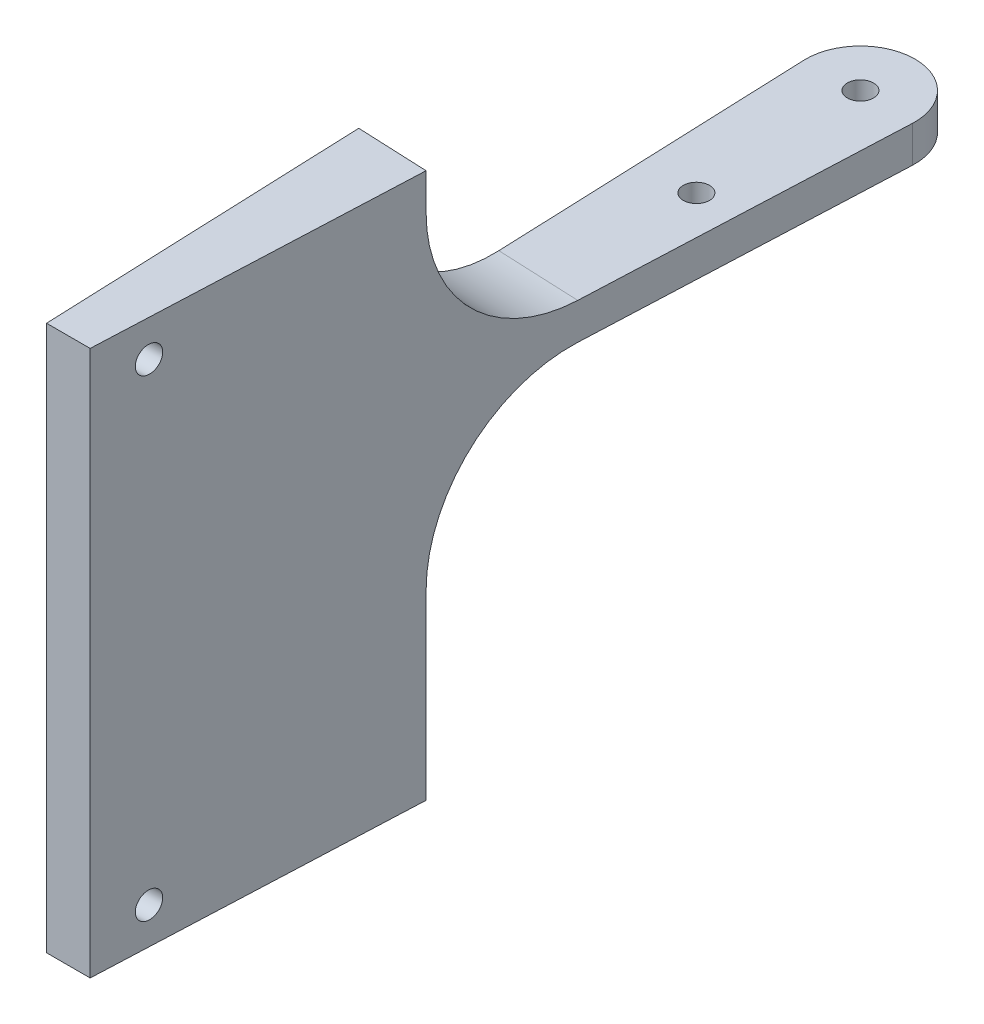
ISO-10303-21;
HEADER;
FILE_DESCRIPTION(('STEP AP214'),'2;1');
FILE_NAME('part.step','',(''),(''),'','','');
FILE_SCHEMA(('AUTOMOTIVE_DESIGN { 1 0 10303 214 1 1 1 1 }'));
ENDSEC;
DATA;
#1=APPLICATION_CONTEXT('core data for automotive mechanical design processes');
#2=APPLICATION_PROTOCOL_DEFINITION('international standard','automotive_design',2000,#1);
#3=PRODUCT_CONTEXT('',#1,'mechanical');
#4=PRODUCT('Part','Part','',(#3));
#5=PRODUCT_RELATED_PRODUCT_CATEGORY('part','',(#4));
#6=PRODUCT_DEFINITION_FORMATION('','',#4);
#7=PRODUCT_DEFINITION_CONTEXT('part definition',#1,'design');
#8=PRODUCT_DEFINITION('design','',#6,#7);
#9=PRODUCT_DEFINITION_SHAPE('','',#8);
#10=(LENGTH_UNIT() NAMED_UNIT(*) SI_UNIT(.MILLI.,.METRE.));
#11=(NAMED_UNIT(*) PLANE_ANGLE_UNIT() SI_UNIT($,.RADIAN.));
#12=(NAMED_UNIT(*) SI_UNIT($,.STERADIAN.) SOLID_ANGLE_UNIT());
#13=UNCERTAINTY_MEASURE_WITH_UNIT(LENGTH_MEASURE(1.E-05),#10,'distance_accuracy_value','');
#14=(GEOMETRIC_REPRESENTATION_CONTEXT(3) GLOBAL_UNCERTAINTY_ASSIGNED_CONTEXT((#13)) GLOBAL_UNIT_ASSIGNED_CONTEXT((#10,
#11,#12)) REPRESENTATION_CONTEXT('',''));
#15=CARTESIAN_POINT('',(0.,0.,0.));
#16=DIRECTION('',(0.,0.,1.));
#17=DIRECTION('',(1.,0.,0.));
#18=AXIS2_PLACEMENT_3D('',#15,#16,#17);
#19=CARTESIAN_POINT('',(11.0642197604741,5.,0.484217790133408));
#20=DIRECTION('',(0.999043716659606,0.,0.043722445070709));
#21=DIRECTION('',(0.043722445070709,0.,-0.999043716659606));
#22=AXIS2_PLACEMENT_3D('',#19,#20,#21);
#23=PLANE('',#22);
#24=CARTESIAN_POINT('',(6.33934570406994,-40.,108.446060510152));
#25=DIRECTION('',(0.999043716659606,0.,0.043722445070709));
#26=DIRECTION('',(-0.043722445070709,0.,0.999043716659606));
#27=AXIS2_PLACEMENT_3D('',#24,#25,#26);
#28=ELLIPSE('',#27,1.8061980830107,1.8);
#29=CARTESIAN_POINT('',(6.26037430759868,-40.,110.250531356026));
#30=VERTEX_POINT('',#29);
#31=EDGE_CURVE('E363',#30,#30,#28,.T.);
#32=ORIENTED_EDGE('',*,*,#31,.F.);
#33=EDGE_LOOP('',(#32));
#34=FACE_BOUND('',#33,.T.);
#35=CARTESIAN_POINT('',(6.33934570406994,25.,108.446060510152));
#36=DIRECTION('',(0.999043716659606,0.,0.043722445070709));
#37=DIRECTION('',(-0.043722445070709,0.,0.999043716659606));
#38=AXIS2_PLACEMENT_3D('',#35,#36,#37);
#39=ELLIPSE('',#38,1.8061980830107,1.8);
#40=CARTESIAN_POINT('',(6.26037430759868,25.,110.250531356026));
#41=VERTEX_POINT('',#40);
#42=EDGE_CURVE('E367',#41,#41,#39,.T.);
#43=ORIENTED_EDGE('',*,*,#42,.F.);
#44=EDGE_LOOP('',(#43));
#45=FACE_BOUND('',#44,.T.);
#46=DIRECTION('',(-0.043722445070709,0.,0.999043716659606));
#47=VECTOR('',#46,1.);
#48=CARTESIAN_POINT('',(11.0642197604741,5.,0.484217790133408));
#49=LINE('',#48,#47);
#50=CARTESIAN_POINT('',(10.742827874947,5.,7.82791833803032));
#51=VERTEX_POINT('',#50);
#52=CARTESIAN_POINT('',(8.81200819002346,5.,51.9465231211344));
#53=VERTEX_POINT('',#52);
#54=EDGE_CURVE('E185',#51,#53,#49,.T.);
#55=ORIENTED_EDGE('',*,*,#54,.T.);
#56=CARTESIAN_POINT('',(8.81200819002346,25.,51.9465231211344));
#57=DIRECTION('',(0.999043716659606,0.,0.043722445070709));
#58=DIRECTION('',(0.043722445070709,0.,-0.999043716659606));
#59=AXIS2_PLACEMENT_3D('',#56,#57,#58);
#60=CIRCLE('',#59,20.);
#61=CARTESIAN_POINT('',(7.93755928860928,25.,71.9273974543265));
#62=VERTEX_POINT('',#61);
#63=EDGE_CURVE('E12',#53,#62,#60,.F.);
#64=ORIENTED_EDGE('',*,*,#63,.T.);
#65=DIRECTION('',(0.,1.,0.));
#66=VECTOR('',#65,1.);
#67=CARTESIAN_POINT('',(7.93755928860928,-45.,71.9273974543265));
#68=LINE('',#67,#66);
#69=CARTESIAN_POINT('',(7.93755928860928,30.,71.9273974543265));
#70=VERTEX_POINT('',#69);
#71=EDGE_CURVE('E176',#62,#70,#68,.T.);
#72=ORIENTED_EDGE('',*,*,#71,.T.);
#73=DIRECTION('',(0.043722445070709,0.,-0.999043716659606));
#74=VECTOR('',#73,1.);
#75=CARTESIAN_POINT('',(7.93755928860928,30.,71.9273974543265));
#76=LINE('',#75,#74);
#77=CARTESIAN_POINT('',(6.00000000000001,30.,116.2));
#78=VERTEX_POINT('',#77);
#79=EDGE_CURVE('E152',#78,#70,#76,.T.);
#80=ORIENTED_EDGE('',*,*,#79,.F.);
#81=DIRECTION('',(0.,-1.,0.));
#82=VECTOR('',#81,1.);
#83=CARTESIAN_POINT('',(6.00000000000001,5.,116.2));
#84=LINE('',#83,#82);
#85=CARTESIAN_POINT('',(6.00000000000001,-45.,116.2));
#86=VERTEX_POINT('',#85);
#87=EDGE_CURVE('E144',#78,#86,#84,.T.);
#88=ORIENTED_EDGE('',*,*,#87,.T.);
#89=DIRECTION('',(0.043722445070709,0.,-0.999043716659606));
#90=VECTOR('',#89,1.);
#91=CARTESIAN_POINT('',(7.93755928860928,-45.,71.9273974543265));
#92=LINE('',#91,#90);
#93=CARTESIAN_POINT('',(7.93755928860928,-45.,71.9273974543265));
#94=VERTEX_POINT('',#93);
#95=EDGE_CURVE('E170',#86,#94,#92,.T.);
#96=ORIENTED_EDGE('',*,*,#95,.T.);
#97=CARTESIAN_POINT('',(7.93755928860928,-20.,71.9273974543265));
#98=VERTEX_POINT('',#97);
#99=EDGE_CURVE('E182',#94,#98,#68,.T.);
#100=ORIENTED_EDGE('',*,*,#99,.T.);
#101=CARTESIAN_POINT('',(8.81200819002346,-20.,51.9465231211344));
#102=DIRECTION('',(0.999043716659606,0.,0.043722445070709));
#103=DIRECTION('',(0.043722445070709,0.,-0.999043716659606));
#104=AXIS2_PLACEMENT_3D('',#101,#102,#103);
#105=CIRCLE('',#104,20.);
#106=CARTESIAN_POINT('',(8.81200819002346,0.,51.9465231211344));
#107=VERTEX_POINT('',#106);
#108=EDGE_CURVE('E213',#98,#107,#105,.F.);
#109=ORIENTED_EDGE('',*,*,#108,.T.);
#110=DIRECTION('',(-0.043722445070709,0.,0.999043716659606));
#111=VECTOR('',#110,1.);
#112=CARTESIAN_POINT('',(11.0642197604741,0.,0.484217790133408));
#113=LINE('',#112,#111);
#114=CARTESIAN_POINT('',(10.742827874947,0.,7.82791833803032));
#115=VERTEX_POINT('',#114);
#116=EDGE_CURVE('E180',#115,#107,#113,.T.);
#117=ORIENTED_EDGE('',*,*,#116,.F.);
#118=DIRECTION('',(0.,-1.,0.));
#119=VECTOR('',#118,1.);
#120=CARTESIAN_POINT('',(10.742827874947,5.,7.82791833803032));
#121=LINE('',#120,#119);
#122=EDGE_CURVE('E200',#51,#115,#121,.T.);
#123=ORIENTED_EDGE('',*,*,#122,.F.);
#124=EDGE_LOOP('',(#55,#64,#72,#80,#88,#96,#100,#109,#117,#123));
#125=FACE_BOUND('',#124,.T.);
#126=ADVANCED_FACE('F56',(#34,#45,#125),#23,.T.);
#127=CARTESIAN_POINT('',(3.25,5.,7.5));
#128=DIRECTION('',(0.,-1.,0.));
#129=DIRECTION('',(0.,0.,-1.));
#130=AXIS2_PLACEMENT_3D('',#127,#128,#129);
#131=CYLINDRICAL_SURFACE('',#130,7.5);
#132=CARTESIAN_POINT('',(3.25,0.,7.5));
#133=DIRECTION('',(0.,1.,0.));
#134=DIRECTION('',(0.,0.,1.));
#135=AXIS2_PLACEMENT_3D('',#132,#133,#134);
#136=CIRCLE('',#135,7.5);
#137=CARTESIAN_POINT('',(-4.24425850972163,0.,7.79340993416196));
#138=VERTEX_POINT('',#137);
#139=EDGE_CURVE('E194',#115,#138,#136,.T.);
#140=ORIENTED_EDGE('',*,*,#139,.T.);
#141=DIRECTION('',(0.,-1.,0.));
#142=VECTOR('',#141,1.);
#143=CARTESIAN_POINT('',(-4.24425850972163,5.,7.79340993416196));
#144=LINE('',#143,#142);
#145=CARTESIAN_POINT('',(-4.24425850972163,5.,7.79340993416196));
#146=VERTEX_POINT('',#145);
#147=EDGE_CURVE('E143',#146,#138,#144,.T.);
#148=ORIENTED_EDGE('',*,*,#147,.F.);
#149=CARTESIAN_POINT('',(3.25,5.,7.5));
#150=DIRECTION('',(0.,1.,0.));
#151=DIRECTION('',(0.,0.,1.));
#152=AXIS2_PLACEMENT_3D('',#149,#150,#151);
#153=CIRCLE('',#152,7.5);
#154=EDGE_CURVE('E187',#51,#146,#153,.T.);
#155=ORIENTED_EDGE('',*,*,#154,.F.);
#156=ORIENTED_EDGE('',*,*,#122,.T.);
#157=EDGE_LOOP('',(#140,#148,#155,#156));
#158=FACE_BOUND('',#157,.T.);
#159=ADVANCED_FACE('F241',(#158),#131,.T.);
#160=CARTESIAN_POINT('',(-4.5424178827925,5.,0.177841547659096));
#161=DIRECTION('',(0.999234467962884,0.,-0.0391213245549277));
#162=DIRECTION('',(-0.0391213245549277,0.,-0.999234467962884));
#163=AXIS2_PLACEMENT_3D('',#160,#161,#162);
#164=PLANE('',#163);
#165=CARTESIAN_POINT('',(-0.293409934161943,-40.,108.705741490278));
#166=DIRECTION('',(-0.999234467962884,0.,0.0391213245549277));
#167=DIRECTION('',(0.0391213245549277,0.,0.999234467962884));
#168=AXIS2_PLACEMENT_3D('',#165,#166,#167);
#169=CIRCLE('',#168,1.8);
#170=CARTESIAN_POINT('',(-0.222991549963073,-40.,110.504363532612));
#171=VERTEX_POINT('',#170);
#172=EDGE_CURVE('E366',#171,#171,#169,.T.);
#173=ORIENTED_EDGE('',*,*,#172,.F.);
#174=EDGE_LOOP('',(#173));
#175=FACE_BOUND('',#174,.T.);
#176=CARTESIAN_POINT('',(-0.293409934161943,25.,108.705741490278));
#177=DIRECTION('',(-0.999234467962884,0.,0.0391213245549277));
#178=DIRECTION('',(0.0391213245549277,0.,0.999234467962884));
#179=AXIS2_PLACEMENT_3D('',#176,#177,#178);
#180=CIRCLE('',#179,1.8);
#181=CARTESIAN_POINT('',(-0.222991549963073,25.,110.504363532612));
#182=VERTEX_POINT('',#181);
#183=EDGE_CURVE('E368',#182,#182,#180,.T.);
#184=ORIENTED_EDGE('',*,*,#183,.F.);
#185=EDGE_LOOP('',(#184));
#186=FACE_BOUND('',#185,.T.);
#187=DIRECTION('',(0.0391213245549277,0.,0.999234467962884));
#188=VECTOR('',#187,1.);
#189=CARTESIAN_POINT('',(-4.5424178827925,0.,0.177841547659096));
#190=LINE('',#189,#188);
#191=CARTESIAN_POINT('',(-2.53504927683207,0.,51.4499271378599));
#192=VERTEX_POINT('',#191);
#193=EDGE_CURVE('E188',#138,#192,#190,.T.);
#194=ORIENTED_EDGE('',*,*,#193,.T.);
#195=CARTESIAN_POINT('',(-2.53504927683207,-20.,51.4499271378599));
#196=DIRECTION('',(0.999234467962884,0.,-0.0391213245549277));
#197=DIRECTION('',(-0.0391213245549277,0.,-0.999234467962884));
#198=AXIS2_PLACEMENT_3D('',#195,#196,#197);
#199=ELLIPSE('',#198,20.0688675890078,20.);
#200=CARTESIAN_POINT('',(-1.74992859443262,-20.,71.5034313657797));
#201=VERTEX_POINT('',#200);
#202=EDGE_CURVE('E211',#192,#201,#199,.T.);
#203=ORIENTED_EDGE('',*,*,#202,.T.);
#204=DIRECTION('',(0.,1.,0.));
#205=VECTOR('',#204,1.);
#206=CARTESIAN_POINT('',(-1.74992859443262,-45.,71.5034313657797));
#207=LINE('',#206,#205);
#208=CARTESIAN_POINT('',(-1.74992859443262,-45.,71.5034313657797));
#209=VERTEX_POINT('',#208);
#210=EDGE_CURVE('E177',#209,#201,#207,.T.);
#211=ORIENTED_EDGE('',*,*,#210,.F.);
#212=DIRECTION('',(0.0391213245549276,0.,0.999234467962884));
#213=VECTOR('',#212,1.);
#214=CARTESIAN_POINT('',(0.,-45.,116.2));
#215=LINE('',#214,#213);
#216=CARTESIAN_POINT('',(0.,-45.,116.2));
#217=VERTEX_POINT('',#216);
#218=EDGE_CURVE('E139',#209,#217,#215,.T.);
#219=ORIENTED_EDGE('',*,*,#218,.T.);
#220=DIRECTION('',(0.,-1.,0.));
#221=VECTOR('',#220,1.);
#222=CARTESIAN_POINT('',(0.,5.,116.2));
#223=LINE('',#222,#221);
#224=CARTESIAN_POINT('',(0.,30.,116.2));
#225=VERTEX_POINT('',#224);
#226=EDGE_CURVE('E132',#225,#217,#223,.T.);
#227=ORIENTED_EDGE('',*,*,#226,.F.);
#228=DIRECTION('',(0.0391213245549276,0.,0.999234467962884));
#229=VECTOR('',#228,1.);
#230=CARTESIAN_POINT('',(0.,30.,116.2));
#231=LINE('',#230,#229);
#232=CARTESIAN_POINT('',(-1.74992859443262,30.,71.5034313657797));
#233=VERTEX_POINT('',#232);
#234=EDGE_CURVE('E137',#233,#225,#231,.T.);
#235=ORIENTED_EDGE('',*,*,#234,.F.);
#236=CARTESIAN_POINT('',(-1.74992859443262,25.,71.5034313657797));
#237=VERTEX_POINT('',#236);
#238=EDGE_CURVE('E181',#237,#233,#207,.T.);
#239=ORIENTED_EDGE('',*,*,#238,.F.);
#240=CARTESIAN_POINT('',(-2.53504927683207,25.,51.4499271378599));
#241=DIRECTION('',(0.999234467962884,0.,-0.0391213245549277));
#242=DIRECTION('',(0.0391213245549277,0.,0.999234467962884));
#243=AXIS2_PLACEMENT_3D('',#240,#241,#242);
#244=ELLIPSE('',#243,20.0688675890078,20.);
#245=CARTESIAN_POINT('',(-2.53504927683207,5.,51.4499271378599));
#246=VERTEX_POINT('',#245);
#247=EDGE_CURVE('E64',#237,#246,#244,.T.);
#248=ORIENTED_EDGE('',*,*,#247,.T.);
#249=DIRECTION('',(0.0391213245549277,0.,0.999234467962884));
#250=VECTOR('',#249,1.);
#251=CARTESIAN_POINT('',(-4.5424178827925,5.,0.177841547659096));
#252=LINE('',#251,#250);
#253=EDGE_CURVE('E190',#146,#246,#252,.T.);
#254=ORIENTED_EDGE('',*,*,#253,.F.);
#255=ORIENTED_EDGE('',*,*,#147,.T.);
#256=EDGE_LOOP('',(#194,#203,#211,#219,#227,#235,#239,#248,#254,#255));
#257=FACE_BOUND('',#256,.T.);
#258=ADVANCED_FACE('F135',(#175,#186,#257),#164,.F.);
#259=CARTESIAN_POINT('',(0.,5.,116.2));
#260=DIRECTION('',(0.,0.,-1.));
#261=DIRECTION('',(-1.,0.,0.));
#262=AXIS2_PLACEMENT_3D('',#259,#260,#261);
#263=PLANE('',#262);
#264=ORIENTED_EDGE('',*,*,#226,.T.);
#265=DIRECTION('',(1.,0.,0.));
#266=VECTOR('',#265,1.);
#267=CARTESIAN_POINT('',(6.00000000000001,-45.,116.2));
#268=LINE('',#267,#266);
#269=EDGE_CURVE('E168',#217,#86,#268,.T.);
#270=ORIENTED_EDGE('',*,*,#269,.T.);
#271=ORIENTED_EDGE('',*,*,#87,.F.);
#272=DIRECTION('',(1.,0.,0.));
#273=VECTOR('',#272,1.);
#274=CARTESIAN_POINT('',(6.00000000000001,30.,116.2));
#275=LINE('',#274,#273);
#276=EDGE_CURVE('E147',#225,#78,#275,.T.);
#277=ORIENTED_EDGE('',*,*,#276,.F.);
#278=EDGE_LOOP('',(#264,#270,#271,#277));
#279=FACE_BOUND('',#278,.T.);
#280=ADVANCED_FACE('F148',(#279),#263,.F.);
#281=CARTESIAN_POINT('',(0.,0.,0.));
#282=DIRECTION('',(0.,1.,0.));
#283=DIRECTION('',(0.,0.,1.));
#284=AXIS2_PLACEMENT_3D('',#281,#282,#283);
#285=PLANE('',#284);
#286=CARTESIAN_POINT('',(3.24999999999994,0.,7.50000000000062));
#287=DIRECTION('',(0.,1.,0.));
#288=DIRECTION('',(0.,0.,1.));
#289=AXIS2_PLACEMENT_3D('',#286,#287,#288);
#290=CIRCLE('',#289,1.8);
#291=CARTESIAN_POINT('',(3.24999999999994,0.,9.30000000000062));
#292=VERTEX_POINT('',#291);
#293=EDGE_CURVE('E158',#292,#292,#290,.T.);
#294=ORIENTED_EDGE('',*,*,#293,.T.);
#295=EDGE_LOOP('',(#294));
#296=FACE_BOUND('',#295,.T.);
#297=CARTESIAN_POINT('',(4.16935112704072,0.,30.9820099971284));
#298=DIRECTION('',(0.,1.,0.));
#299=DIRECTION('',(0.,0.,1.));
#300=AXIS2_PLACEMENT_3D('',#297,#298,#299);
#301=CIRCLE('',#300,1.8);
#302=CARTESIAN_POINT('',(4.16935112704072,0.,32.7820099971284));
#303=VERTEX_POINT('',#302);
#304=EDGE_CURVE('E161',#303,#303,#301,.T.);
#305=ORIENTED_EDGE('',*,*,#304,.T.);
#306=EDGE_LOOP('',(#305));
#307=FACE_BOUND('',#306,.T.);
#308=ORIENTED_EDGE('',*,*,#116,.T.);
#309=DIRECTION('',(-0.999043716659606,0.,-0.0437224450707097));
#310=VECTOR('',#309,1.);
#311=CARTESIAN_POINT('',(-2.25221157045064,0.,51.4623053310009));
#312=LINE('',#311,#310);
#313=EDGE_CURVE('E202',#107,#192,#312,.T.);
#314=ORIENTED_EDGE('',*,*,#313,.T.);
#315=ORIENTED_EDGE('',*,*,#193,.F.);
#316=ORIENTED_EDGE('',*,*,#139,.F.);
#317=EDGE_LOOP('',(#308,#314,#315,#316));
#318=FACE_BOUND('',#317,.T.);
#319=ADVANCED_FACE('F222',(#296,#307,#318),#285,.F.);
#320=CARTESIAN_POINT('',(0.,5.,0.));
#321=DIRECTION('',(0.,1.,0.));
#322=DIRECTION('',(0.,0.,1.));
#323=AXIS2_PLACEMENT_3D('',#320,#321,#322);
#324=PLANE('',#323);
#325=CARTESIAN_POINT('',(3.24999999999994,5.,7.50000000000062));
#326=DIRECTION('',(0.,1.,0.));
#327=DIRECTION('',(0.,0.,1.));
#328=AXIS2_PLACEMENT_3D('',#325,#326,#327);
#329=CIRCLE('',#328,1.8);
#330=CARTESIAN_POINT('',(3.24999999999994,5.,9.30000000000062));
#331=VERTEX_POINT('',#330);
#332=EDGE_CURVE('E377',#331,#331,#329,.T.);
#333=ORIENTED_EDGE('',*,*,#332,.F.);
#334=EDGE_LOOP('',(#333));
#335=FACE_BOUND('',#334,.T.);
#336=CARTESIAN_POINT('',(4.16935112704072,5.,30.9820099971284));
#337=DIRECTION('',(0.,1.,0.));
#338=DIRECTION('',(0.,0.,1.));
#339=AXIS2_PLACEMENT_3D('',#336,#337,#338);
#340=CIRCLE('',#339,1.8);
#341=CARTESIAN_POINT('',(4.16935112704072,5.,32.7820099971284));
#342=VERTEX_POINT('',#341);
#343=EDGE_CURVE('E376',#342,#342,#340,.T.);
#344=ORIENTED_EDGE('',*,*,#343,.F.);
#345=EDGE_LOOP('',(#344));
#346=FACE_BOUND('',#345,.T.);
#347=ORIENTED_EDGE('',*,*,#253,.T.);
#348=DIRECTION('',(-0.999043716659606,0.,-0.0437224450707097));
#349=VECTOR('',#348,1.);
#350=CARTESIAN_POINT('',(8.81200819002348,5.,51.9465231211344));
#351=LINE('',#350,#349);
#352=EDGE_CURVE('E77',#246,#53,#351,.F.);
#353=ORIENTED_EDGE('',*,*,#352,.T.);
#354=ORIENTED_EDGE('',*,*,#54,.F.);
#355=ORIENTED_EDGE('',*,*,#154,.T.);
#356=EDGE_LOOP('',(#347,#353,#354,#355));
#357=FACE_BOUND('',#356,.T.);
#358=ADVANCED_FACE('F238',(#335,#346,#357),#324,.T.);
#359=CARTESIAN_POINT('',(0.,30.,0.));
#360=DIRECTION('',(0.,1.,0.));
#361=DIRECTION('',(0.,0.,1.));
#362=AXIS2_PLACEMENT_3D('',#359,#360,#361);
#363=PLANE('',#362);
#364=ORIENTED_EDGE('',*,*,#234,.T.);
#365=ORIENTED_EDGE('',*,*,#276,.T.);
#366=ORIENTED_EDGE('',*,*,#79,.T.);
#367=DIRECTION('',(-0.999043716659606,0.,-0.0437224450707097));
#368=VECTOR('',#367,1.);
#369=CARTESIAN_POINT('',(-1.74992859443262,30.,71.5034313657797));
#370=LINE('',#369,#368);
#371=EDGE_CURVE('E157',#70,#233,#370,.T.);
#372=ORIENTED_EDGE('',*,*,#371,.T.);
#373=EDGE_LOOP('',(#364,#365,#366,#372));
#374=FACE_BOUND('',#373,.T.);
#375=ADVANCED_FACE('F155',(#374),#363,.T.);
#376=CARTESIAN_POINT('',(-1.74992859443262,-45.,71.5034313657797));
#377=DIRECTION('',(0.0437224450707097,0.,-0.999043716659606));
#378=DIRECTION('',(-0.999043716659606,0.,-0.0437224450707097));
#379=AXIS2_PLACEMENT_3D('',#376,#377,#378);
#380=PLANE('',#379);
#381=ORIENTED_EDGE('',*,*,#71,.F.);
#382=DIRECTION('',(-0.999043716659606,0.,-0.0437224450707097));
#383=VECTOR('',#382,1.);
#384=CARTESIAN_POINT('',(-1.74992859443263,25.,71.5034313657797));
#385=LINE('',#384,#383);
#386=EDGE_CURVE('E207',#62,#237,#385,.T.);
#387=ORIENTED_EDGE('',*,*,#386,.T.);
#388=ORIENTED_EDGE('',*,*,#238,.T.);
#389=ORIENTED_EDGE('',*,*,#371,.F.);
#390=EDGE_LOOP('',(#381,#387,#388,#389));
#391=FACE_BOUND('',#390,.T.);
#392=ADVANCED_FACE('F233',(#391),#380,.T.);
#393=ORIENTED_EDGE('',*,*,#210,.T.);
#394=DIRECTION('',(-0.999043716659606,0.,-0.0437224450707097));
#395=VECTOR('',#394,1.);
#396=CARTESIAN_POINT('',(-1.74992859443262,-20.,71.5034313657797));
#397=LINE('',#396,#395);
#398=EDGE_CURVE('E205',#201,#98,#397,.F.);
#399=ORIENTED_EDGE('',*,*,#398,.T.);
#400=ORIENTED_EDGE('',*,*,#99,.F.);
#401=DIRECTION('',(-0.999043716659606,0.,-0.0437224450707097));
#402=VECTOR('',#401,1.);
#403=CARTESIAN_POINT('',(-1.74992859443262,-45.,71.5034313657797));
#404=LINE('',#403,#402);
#405=EDGE_CURVE('E173',#94,#209,#404,.T.);
#406=ORIENTED_EDGE('',*,*,#405,.T.);
#407=EDGE_LOOP('',(#393,#399,#400,#406));
#408=FACE_BOUND('',#407,.T.);
#409=ADVANCED_FACE('F226',(#408),#380,.T.);
#410=CARTESIAN_POINT('',(0.,-45.,0.));
#411=DIRECTION('',(0.,1.,0.));
#412=DIRECTION('',(0.,0.,1.));
#413=AXIS2_PLACEMENT_3D('',#410,#411,#412);
#414=PLANE('',#413);
#415=ORIENTED_EDGE('',*,*,#218,.F.);
#416=ORIENTED_EDGE('',*,*,#405,.F.);
#417=ORIENTED_EDGE('',*,*,#95,.F.);
#418=ORIENTED_EDGE('',*,*,#269,.F.);
#419=EDGE_LOOP('',(#415,#416,#417,#418));
#420=FACE_BOUND('',#419,.T.);
#421=ADVANCED_FACE('F230',(#420),#414,.F.);
#422=CARTESIAN_POINT('',(-2.25221157045064,-20.,51.462305331001));
#423=DIRECTION('',(-0.999043716659606,0.,-0.0437224450707097));
#424=DIRECTION('',(-0.0437224450707097,0.,0.999043716659606));
#425=AXIS2_PLACEMENT_3D('',#422,#423,#424);
#426=CYLINDRICAL_SURFACE('',#425,20.);
#427=ORIENTED_EDGE('',*,*,#108,.F.);
#428=ORIENTED_EDGE('',*,*,#398,.F.);
#429=ORIENTED_EDGE('',*,*,#202,.F.);
#430=ORIENTED_EDGE('',*,*,#313,.F.);
#431=EDGE_LOOP('',(#427,#428,#429,#430));
#432=FACE_BOUND('',#431,.T.);
#433=ADVANCED_FACE('F224',(#432),#426,.F.);
#434=CARTESIAN_POINT('',(-0.87547969301843,25.,51.5225570325875));
#435=DIRECTION('',(0.999043716659606,0.,0.0437224450707097));
#436=DIRECTION('',(0.0437224450707097,0.,-0.999043716659606));
#437=AXIS2_PLACEMENT_3D('',#434,#435,#436);
#438=CYLINDRICAL_SURFACE('',#437,20.);
#439=ORIENTED_EDGE('',*,*,#63,.F.);
#440=ORIENTED_EDGE('',*,*,#352,.F.);
#441=ORIENTED_EDGE('',*,*,#247,.F.);
#442=ORIENTED_EDGE('',*,*,#386,.F.);
#443=EDGE_LOOP('',(#439,#440,#441,#442));
#444=FACE_BOUND('',#443,.T.);
#445=ADVANCED_FACE('F58',(#444),#438,.F.);
#446=CARTESIAN_POINT('',(4.16935112704072,-14.,30.9820099971284));
#447=DIRECTION('',(0.,1.,0.));
#448=DIRECTION('',(0.,0.,1.));
#449=AXIS2_PLACEMENT_3D('',#446,#447,#448);
#450=CYLINDRICAL_SURFACE('',#449,1.8);
#451=ORIENTED_EDGE('',*,*,#343,.T.);
#452=EDGE_LOOP('',(#451));
#453=FACE_BOUND('',#452,.T.);
#454=ORIENTED_EDGE('',*,*,#304,.F.);
#455=EDGE_LOOP('',(#454));
#456=FACE_BOUND('',#455,.T.);
#457=ADVANCED_FACE('F259',(#453,#456),#450,.F.);
#458=CARTESIAN_POINT('',(3.24999999999994,-14.,7.50000000000062));
#459=DIRECTION('',(0.,1.,0.));
#460=DIRECTION('',(0.,0.,1.));
#461=AXIS2_PLACEMENT_3D('',#458,#459,#460);
#462=CYLINDRICAL_SURFACE('',#461,1.8);
#463=ORIENTED_EDGE('',*,*,#332,.T.);
#464=EDGE_LOOP('',(#463));
#465=FACE_BOUND('',#464,.T.);
#466=ORIENTED_EDGE('',*,*,#293,.F.);
#467=EDGE_LOOP('',(#466));
#468=FACE_BOUND('',#467,.T.);
#469=ADVANCED_FACE('F323',(#465,#468),#462,.F.);
#470=CARTESIAN_POINT('',(9.6989347454669,25.,108.314528244729));
#471=DIRECTION('',(-0.999234467962884,0.,0.0391213245549277));
#472=DIRECTION('',(0.0391213245549277,0.,0.999234467962884));
#473=AXIS2_PLACEMENT_3D('',#470,#471,#472);
#474=CYLINDRICAL_SURFACE('',#473,1.8);
#475=ORIENTED_EDGE('',*,*,#42,.T.);
#476=EDGE_LOOP('',(#475));
#477=FACE_BOUND('',#476,.T.);
#478=ORIENTED_EDGE('',*,*,#183,.T.);
#479=EDGE_LOOP('',(#478));
#480=FACE_BOUND('',#479,.T.);
#481=ADVANCED_FACE('F331',(#477,#480),#474,.F.);
#482=CARTESIAN_POINT('',(9.6989347454669,-40.,108.314528244729));
#483=DIRECTION('',(-0.999234467962884,0.,0.0391213245549277));
#484=DIRECTION('',(0.0391213245549277,0.,0.999234467962884));
#485=AXIS2_PLACEMENT_3D('',#482,#483,#484);
#486=CYLINDRICAL_SURFACE('',#485,1.8);
#487=ORIENTED_EDGE('',*,*,#31,.T.);
#488=EDGE_LOOP('',(#487));
#489=FACE_BOUND('',#488,.T.);
#490=ORIENTED_EDGE('',*,*,#172,.T.);
#491=EDGE_LOOP('',(#490));
#492=FACE_BOUND('',#491,.T.);
#493=ADVANCED_FACE('F346',(#489,#492),#486,.F.);
#494=CLOSED_SHELL('',(#126,#159,#258,#280,#319,#358,#375,#392,#409,#421,#433,#445,#457,#469,
#481,#493));
#495=MANIFOLD_SOLID_BREP('B2',#494);
#496=ADVANCED_BREP_SHAPE_REPRESENTATION('',(#18,#495),#14);
#497=SHAPE_DEFINITION_REPRESENTATION(#9,#496);
ENDSEC;
END-ISO-10303-21;
